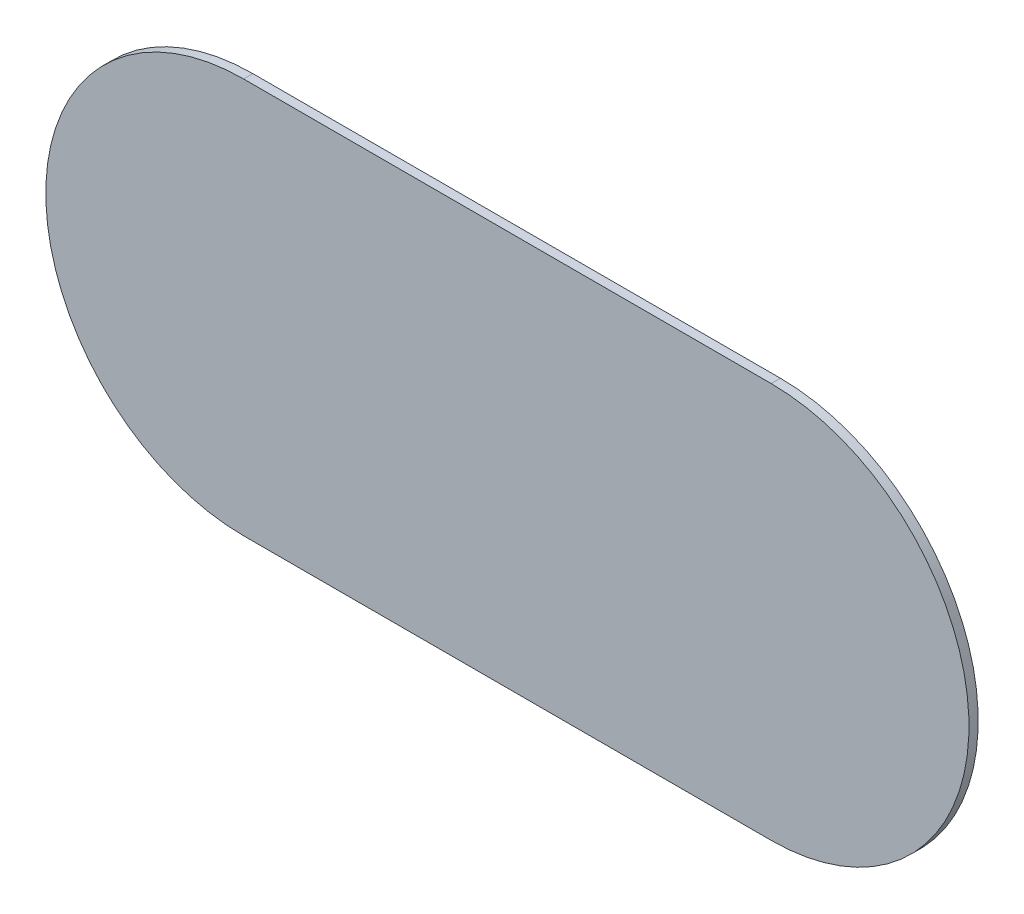
ISO-10303-21;
HEADER;
FILE_DESCRIPTION(('STEP AP214'),'2;1');
FILE_NAME('part.step','',(''),(''),'','','');
FILE_SCHEMA(('AUTOMOTIVE_DESIGN { 1 0 10303 214 1 1 1 1 }'));
ENDSEC;
DATA;
#1=APPLICATION_CONTEXT('core data for automotive mechanical design processes');
#2=APPLICATION_PROTOCOL_DEFINITION('international standard','automotive_design',2000,#1);
#3=PRODUCT_CONTEXT('',#1,'mechanical');
#4=PRODUCT('Part','Part','',(#3));
#5=PRODUCT_RELATED_PRODUCT_CATEGORY('part','',(#4));
#6=PRODUCT_DEFINITION_FORMATION('','',#4);
#7=PRODUCT_DEFINITION_CONTEXT('part definition',#1,'design');
#8=PRODUCT_DEFINITION('design','',#6,#7);
#9=PRODUCT_DEFINITION_SHAPE('','',#8);
#10=(LENGTH_UNIT() NAMED_UNIT(*) SI_UNIT(.MILLI.,.METRE.));
#11=(NAMED_UNIT(*) PLANE_ANGLE_UNIT() SI_UNIT($,.RADIAN.));
#12=(NAMED_UNIT(*) SI_UNIT($,.STERADIAN.) SOLID_ANGLE_UNIT());
#13=UNCERTAINTY_MEASURE_WITH_UNIT(LENGTH_MEASURE(1.E-05),#10,'distance_accuracy_value','');
#14=(GEOMETRIC_REPRESENTATION_CONTEXT(3) GLOBAL_UNCERTAINTY_ASSIGNED_CONTEXT((#13)) GLOBAL_UNIT_ASSIGNED_CONTEXT((#10,
#11,#12)) REPRESENTATION_CONTEXT('',''));
#15=CARTESIAN_POINT('',(0.,0.,0.));
#16=DIRECTION('',(0.,0.,1.));
#17=DIRECTION('',(1.,0.,0.));
#18=AXIS2_PLACEMENT_3D('',#15,#16,#17);
#19=CARTESIAN_POINT('',(5.75,-7.5,1.635));
#20=DIRECTION('',(0.,0.,1.));
#21=DIRECTION('',(1.,0.,0.));
#22=AXIS2_PLACEMENT_3D('',#19,#20,#21);
#23=PLANE('',#22);
#24=DIRECTION('',(1.,0.,0.));
#25=VECTOR('',#24,1.);
#26=CARTESIAN_POINT('',(5.75,-7.5,1.635));
#27=LINE('',#26,#25);
#28=CARTESIAN_POINT('',(5.75,-7.5,1.635));
#29=VERTEX_POINT('',#28);
#30=CARTESIAN_POINT('',(7.75,-7.5,1.635));
#31=VERTEX_POINT('',#30);
#32=EDGE_CURVE('E87',#29,#31,#27,.T.);
#33=ORIENTED_EDGE('',*,*,#32,.T.);
#34=CARTESIAN_POINT('',(7.75,-6.75,1.635));
#35=DIRECTION('',(0.,0.,1.));
#36=DIRECTION('',(0.,-1.,0.));
#37=AXIS2_PLACEMENT_3D('',#34,#35,#36);
#38=CIRCLE('',#37,0.75);
#39=CARTESIAN_POINT('',(7.75,-6.,1.635));
#40=VERTEX_POINT('',#39);
#41=EDGE_CURVE('E82',#31,#40,#38,.T.);
#42=ORIENTED_EDGE('',*,*,#41,.T.);
#43=DIRECTION('',(-1.,0.,0.));
#44=VECTOR('',#43,1.);
#45=CARTESIAN_POINT('',(7.75,-6.,1.635));
#46=LINE('',#45,#44);
#47=CARTESIAN_POINT('',(5.75,-6.,1.635));
#48=VERTEX_POINT('',#47);
#49=EDGE_CURVE('E114',#40,#48,#46,.T.);
#50=ORIENTED_EDGE('',*,*,#49,.T.);
#51=CARTESIAN_POINT('',(5.75,-6.75,1.635));
#52=DIRECTION('',(0.,0.,1.));
#53=DIRECTION('',(0.,1.,0.));
#54=AXIS2_PLACEMENT_3D('',#51,#52,#53);
#55=CIRCLE('',#54,0.75);
#56=EDGE_CURVE('E11',#48,#29,#55,.T.);
#57=ORIENTED_EDGE('',*,*,#56,.T.);
#58=EDGE_LOOP('',(#33,#42,#50,#57));
#59=FACE_BOUND('',#58,.T.);
#60=ADVANCED_FACE('F16',(#59),#23,.T.);
#61=CARTESIAN_POINT('',(5.75,-7.5,1.6));
#62=DIRECTION('',(0.,0.,1.));
#63=DIRECTION('',(1.,0.,0.));
#64=AXIS2_PLACEMENT_3D('',#61,#62,#63);
#65=PLANE('',#64);
#66=CARTESIAN_POINT('',(5.75,-6.75,1.6));
#67=DIRECTION('',(0.,0.,1.));
#68=DIRECTION('',(0.,1.,0.));
#69=AXIS2_PLACEMENT_3D('',#66,#67,#68);
#70=CIRCLE('',#69,0.75);
#71=CARTESIAN_POINT('',(5.75,-6.,1.6));
#72=VERTEX_POINT('',#71);
#73=CARTESIAN_POINT('',(5.75,-7.5,1.6));
#74=VERTEX_POINT('',#73);
#75=EDGE_CURVE('E20',#72,#74,#70,.T.);
#76=ORIENTED_EDGE('',*,*,#75,.F.);
#77=DIRECTION('',(-1.,0.,0.));
#78=VECTOR('',#77,1.);
#79=CARTESIAN_POINT('',(7.75,-6.,1.6));
#80=LINE('',#79,#78);
#81=CARTESIAN_POINT('',(7.75,-6.,1.6));
#82=VERTEX_POINT('',#81);
#83=EDGE_CURVE('E70',#82,#72,#80,.T.);
#84=ORIENTED_EDGE('',*,*,#83,.F.);
#85=CARTESIAN_POINT('',(7.75,-6.75,1.6));
#86=DIRECTION('',(0.,0.,1.));
#87=DIRECTION('',(0.,-1.,0.));
#88=AXIS2_PLACEMENT_3D('',#85,#86,#87);
#89=CIRCLE('',#88,0.75);
#90=CARTESIAN_POINT('',(7.75,-7.5,1.6));
#91=VERTEX_POINT('',#90);
#92=EDGE_CURVE('E65',#91,#82,#89,.T.);
#93=ORIENTED_EDGE('',*,*,#92,.F.);
#94=DIRECTION('',(1.,0.,0.));
#95=VECTOR('',#94,1.);
#96=CARTESIAN_POINT('',(5.75,-7.5,1.6));
#97=LINE('',#96,#95);
#98=EDGE_CURVE('E68',#74,#91,#97,.T.);
#99=ORIENTED_EDGE('',*,*,#98,.F.);
#100=EDGE_LOOP('',(#76,#84,#93,#99));
#101=FACE_BOUND('',#100,.T.);
#102=ADVANCED_FACE('F18',(#101),#65,.F.);
#103=CARTESIAN_POINT('',(5.75,-6.75,1.6));
#104=DIRECTION('',(0.,0.,-1.));
#105=DIRECTION('',(0.,1.,0.));
#106=AXIS2_PLACEMENT_3D('',#103,#104,#105);
#107=CYLINDRICAL_SURFACE('',#106,0.75);
#108=ORIENTED_EDGE('',*,*,#75,.T.);
#109=DIRECTION('',(0.,0.,1.));
#110=VECTOR('',#109,1.);
#111=CARTESIAN_POINT('',(5.75,-7.5,1.6));
#112=LINE('',#111,#110);
#113=EDGE_CURVE('E76',#74,#29,#112,.T.);
#114=ORIENTED_EDGE('',*,*,#113,.T.);
#115=ORIENTED_EDGE('',*,*,#56,.F.);
#116=DIRECTION('',(0.,0.,1.));
#117=VECTOR('',#116,1.);
#118=CARTESIAN_POINT('',(5.75,-6.,1.6));
#119=LINE('',#118,#117);
#120=EDGE_CURVE('E110',#72,#48,#119,.T.);
#121=ORIENTED_EDGE('',*,*,#120,.F.);
#122=EDGE_LOOP('',(#108,#114,#115,#121));
#123=FACE_BOUND('',#122,.T.);
#124=ADVANCED_FACE('F127',(#123),#107,.T.);
#125=CARTESIAN_POINT('',(7.75,-6.,1.6));
#126=DIRECTION('',(0.,-1.,0.));
#127=DIRECTION('',(0.,0.,-1.));
#128=AXIS2_PLACEMENT_3D('',#125,#126,#127);
#129=PLANE('',#128);
#130=ORIENTED_EDGE('',*,*,#83,.T.);
#131=ORIENTED_EDGE('',*,*,#120,.T.);
#132=ORIENTED_EDGE('',*,*,#49,.F.);
#133=DIRECTION('',(0.,0.,1.));
#134=VECTOR('',#133,1.);
#135=CARTESIAN_POINT('',(7.75,-6.,1.6));
#136=LINE('',#135,#134);
#137=EDGE_CURVE('E75',#82,#40,#136,.T.);
#138=ORIENTED_EDGE('',*,*,#137,.F.);
#139=EDGE_LOOP('',(#130,#131,#132,#138));
#140=FACE_BOUND('',#139,.T.);
#141=ADVANCED_FACE('F120',(#140),#129,.F.);
#142=CARTESIAN_POINT('',(7.75,-6.75,1.6));
#143=DIRECTION('',(0.,0.,-1.));
#144=DIRECTION('',(0.,-1.,0.));
#145=AXIS2_PLACEMENT_3D('',#142,#143,#144);
#146=CYLINDRICAL_SURFACE('',#145,0.75);
#147=ORIENTED_EDGE('',*,*,#92,.T.);
#148=ORIENTED_EDGE('',*,*,#137,.T.);
#149=ORIENTED_EDGE('',*,*,#41,.F.);
#150=DIRECTION('',(0.,0.,1.));
#151=VECTOR('',#150,1.);
#152=CARTESIAN_POINT('',(7.75,-7.5,1.6));
#153=LINE('',#152,#151);
#154=EDGE_CURVE('E79',#91,#31,#153,.T.);
#155=ORIENTED_EDGE('',*,*,#154,.F.);
#156=EDGE_LOOP('',(#147,#148,#149,#155));
#157=FACE_BOUND('',#156,.T.);
#158=ADVANCED_FACE('F80',(#157),#146,.T.);
#159=CARTESIAN_POINT('',(5.75,-7.5,1.6));
#160=DIRECTION('',(0.,1.,0.));
#161=DIRECTION('',(1.,0.,0.));
#162=AXIS2_PLACEMENT_3D('',#159,#160,#161);
#163=PLANE('',#162);
#164=ORIENTED_EDGE('',*,*,#98,.T.);
#165=ORIENTED_EDGE('',*,*,#154,.T.);
#166=ORIENTED_EDGE('',*,*,#32,.F.);
#167=ORIENTED_EDGE('',*,*,#113,.F.);
#168=EDGE_LOOP('',(#164,#165,#166,#167));
#169=FACE_BOUND('',#168,.T.);
#170=ADVANCED_FACE('F90',(#169),#163,.F.);
#171=CLOSED_SHELL('',(#60,#102,#124,#141,#158,#170));
#172=MANIFOLD_SOLID_BREP('B1',#171);
#173=ADVANCED_BREP_SHAPE_REPRESENTATION('',(#18,#172),#14);
#174=SHAPE_DEFINITION_REPRESENTATION(#9,#173);
ENDSEC;
END-ISO-10303-21;
